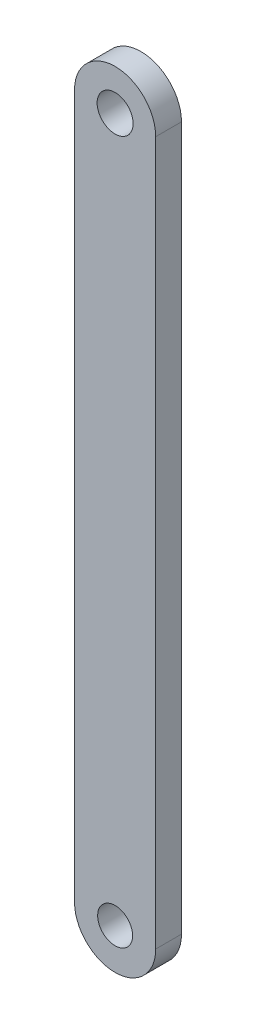
ISO-10303-21;
HEADER;
FILE_DESCRIPTION(('STEP AP214'),'2;1');
FILE_NAME('part.step','',(''),(''),'','','');
FILE_SCHEMA(('AUTOMOTIVE_DESIGN { 1 0 10303 214 1 1 1 1 }'));
ENDSEC;
DATA;
#1=APPLICATION_CONTEXT('core data for automotive mechanical design processes');
#2=APPLICATION_PROTOCOL_DEFINITION('international standard','automotive_design',2000,#1);
#3=PRODUCT_CONTEXT('',#1,'mechanical');
#4=PRODUCT('Part','Part','',(#3));
#5=PRODUCT_RELATED_PRODUCT_CATEGORY('part','',(#4));
#6=PRODUCT_DEFINITION_FORMATION('','',#4);
#7=PRODUCT_DEFINITION_CONTEXT('part definition',#1,'design');
#8=PRODUCT_DEFINITION('design','',#6,#7);
#9=PRODUCT_DEFINITION_SHAPE('','',#8);
#10=(LENGTH_UNIT() NAMED_UNIT(*) SI_UNIT(.MILLI.,.METRE.));
#11=(NAMED_UNIT(*) PLANE_ANGLE_UNIT() SI_UNIT($,.RADIAN.));
#12=(NAMED_UNIT(*) SI_UNIT($,.STERADIAN.) SOLID_ANGLE_UNIT());
#13=UNCERTAINTY_MEASURE_WITH_UNIT(LENGTH_MEASURE(1.E-05),#10,'distance_accuracy_value','');
#14=(GEOMETRIC_REPRESENTATION_CONTEXT(3) GLOBAL_UNCERTAINTY_ASSIGNED_CONTEXT((#13)) GLOBAL_UNIT_ASSIGNED_CONTEXT((#10,
#11,#12)) REPRESENTATION_CONTEXT('',''));
#15=CARTESIAN_POINT('',(0.,0.,0.));
#16=DIRECTION('',(0.,0.,1.));
#17=DIRECTION('',(1.,0.,0.));
#18=AXIS2_PLACEMENT_3D('',#15,#16,#17);
#19=CARTESIAN_POINT('',(0.,0.,4.7625));
#20=DIRECTION('',(0.,0.,1.));
#21=DIRECTION('',(1.,0.,0.));
#22=AXIS2_PLACEMENT_3D('',#19,#20,#21);
#23=PLANE('',#22);
#24=CARTESIAN_POINT('',(0.,0.,4.7625));
#25=DIRECTION('',(0.,0.,1.));
#26=DIRECTION('',(1.,0.,0.));
#27=AXIS2_PLACEMENT_3D('',#24,#25,#26);
#28=CIRCLE('',#27,3.225);
#29=CARTESIAN_POINT('',(-3.225,0.,4.7625));
#30=VERTEX_POINT('',#29);
#31=EDGE_CURVE('E100',#30,#30,#28,.T.);
#32=ORIENTED_EDGE('',*,*,#31,.F.);
#33=EDGE_LOOP('',(#32));
#34=FACE_BOUND('',#33,.T.);
#35=CARTESIAN_POINT('',(0.,0.,4.7625));
#36=DIRECTION('',(0.,0.,1.));
#37=DIRECTION('',(1.,0.,0.));
#38=AXIS2_PLACEMENT_3D('',#35,#36,#37);
#39=CIRCLE('',#38,7.5);
#40=CARTESIAN_POINT('',(-7.5,0.,4.7625));
#41=VERTEX_POINT('',#40);
#42=CARTESIAN_POINT('',(7.5,0.,4.7625));
#43=VERTEX_POINT('',#42);
#44=EDGE_CURVE('E85',#41,#43,#39,.T.);
#45=ORIENTED_EDGE('',*,*,#44,.T.);
#46=DIRECTION('',(0.,1.,0.));
#47=VECTOR('',#46,1.);
#48=CARTESIAN_POINT('',(7.5,0.,4.7625));
#49=LINE('',#48,#47);
#50=CARTESIAN_POINT('',(7.5,130.,4.7625));
#51=VERTEX_POINT('',#50);
#52=EDGE_CURVE('E80',#43,#51,#49,.T.);
#53=ORIENTED_EDGE('',*,*,#52,.T.);
#54=CARTESIAN_POINT('',(0.,130.,4.7625));
#55=DIRECTION('',(0.,0.,1.));
#56=DIRECTION('',(1.,0.,0.));
#57=AXIS2_PLACEMENT_3D('',#54,#55,#56);
#58=CIRCLE('',#57,7.5);
#59=CARTESIAN_POINT('',(-7.5,130.,4.7625));
#60=VERTEX_POINT('',#59);
#61=EDGE_CURVE('E83',#51,#60,#58,.T.);
#62=ORIENTED_EDGE('',*,*,#61,.T.);
#63=DIRECTION('',(0.,-1.,0.));
#64=VECTOR('',#63,1.);
#65=CARTESIAN_POINT('',(-7.5,0.,4.7625));
#66=LINE('',#65,#64);
#67=EDGE_CURVE('E50',#60,#41,#66,.T.);
#68=ORIENTED_EDGE('',*,*,#67,.T.);
#69=EDGE_LOOP('',(#45,#53,#62,#68));
#70=FACE_BOUND('',#69,.T.);
#71=CARTESIAN_POINT('',(0.,130.,4.7625));
#72=DIRECTION('',(0.,0.,1.));
#73=DIRECTION('',(1.,0.,0.));
#74=AXIS2_PLACEMENT_3D('',#71,#72,#73);
#75=CIRCLE('',#74,3.325);
#76=CARTESIAN_POINT('',(-3.325,130.,4.7625));
#77=VERTEX_POINT('',#76);
#78=EDGE_CURVE('E115',#77,#77,#75,.T.);
#79=ORIENTED_EDGE('',*,*,#78,.F.);
#80=EDGE_LOOP('',(#79));
#81=FACE_BOUND('',#80,.T.);
#82=ADVANCED_FACE('F33',(#34,#70,#81),#23,.T.);
#83=CARTESIAN_POINT('',(0.,0.,0.));
#84=DIRECTION('',(0.,0.,1.));
#85=DIRECTION('',(1.,0.,0.));
#86=AXIS2_PLACEMENT_3D('',#83,#84,#85);
#87=PLANE('',#86);
#88=CARTESIAN_POINT('',(0.,0.,0.));
#89=DIRECTION('',(0.,0.,1.));
#90=DIRECTION('',(1.,0.,0.));
#91=AXIS2_PLACEMENT_3D('',#88,#89,#90);
#92=CIRCLE('',#91,7.5);
#93=CARTESIAN_POINT('',(-7.5,0.,0.));
#94=VERTEX_POINT('',#93);
#95=CARTESIAN_POINT('',(7.5,0.,0.));
#96=VERTEX_POINT('',#95);
#97=EDGE_CURVE('E97',#94,#96,#92,.T.);
#98=ORIENTED_EDGE('',*,*,#97,.F.);
#99=DIRECTION('',(0.,-1.,0.));
#100=VECTOR('',#99,1.);
#101=CARTESIAN_POINT('',(-7.5,0.,0.));
#102=LINE('',#101,#100);
#103=CARTESIAN_POINT('',(-7.5,130.,0.));
#104=VERTEX_POINT('',#103);
#105=EDGE_CURVE('E73',#104,#94,#102,.T.);
#106=ORIENTED_EDGE('',*,*,#105,.F.);
#107=CARTESIAN_POINT('',(0.,130.,0.));
#108=DIRECTION('',(0.,0.,1.));
#109=DIRECTION('',(1.,0.,0.));
#110=AXIS2_PLACEMENT_3D('',#107,#108,#109);
#111=CIRCLE('',#110,7.5);
#112=CARTESIAN_POINT('',(7.5,130.,0.));
#113=VERTEX_POINT('',#112);
#114=EDGE_CURVE('E67',#113,#104,#111,.T.);
#115=ORIENTED_EDGE('',*,*,#114,.F.);
#116=DIRECTION('',(0.,1.,0.));
#117=VECTOR('',#116,1.);
#118=CARTESIAN_POINT('',(7.5,0.,0.));
#119=LINE('',#118,#117);
#120=EDGE_CURVE('E89',#96,#113,#119,.T.);
#121=ORIENTED_EDGE('',*,*,#120,.F.);
#122=EDGE_LOOP('',(#98,#106,#115,#121));
#123=FACE_BOUND('',#122,.T.);
#124=CARTESIAN_POINT('',(0.,0.,0.));
#125=DIRECTION('',(0.,0.,1.));
#126=DIRECTION('',(1.,0.,0.));
#127=AXIS2_PLACEMENT_3D('',#124,#125,#126);
#128=CIRCLE('',#127,3.225);
#129=CARTESIAN_POINT('',(-3.225,0.,0.));
#130=VERTEX_POINT('',#129);
#131=EDGE_CURVE('E112',#130,#130,#128,.T.);
#132=ORIENTED_EDGE('',*,*,#131,.T.);
#133=EDGE_LOOP('',(#132));
#134=FACE_BOUND('',#133,.T.);
#135=CARTESIAN_POINT('',(0.,130.,0.));
#136=DIRECTION('',(0.,0.,1.));
#137=DIRECTION('',(1.,0.,0.));
#138=AXIS2_PLACEMENT_3D('',#135,#136,#137);
#139=CIRCLE('',#138,3.325);
#140=CARTESIAN_POINT('',(-3.325,130.,0.));
#141=VERTEX_POINT('',#140);
#142=EDGE_CURVE('E118',#141,#141,#139,.T.);
#143=ORIENTED_EDGE('',*,*,#142,.T.);
#144=EDGE_LOOP('',(#143));
#145=FACE_BOUND('',#144,.T.);
#146=ADVANCED_FACE('F108',(#123,#134,#145),#87,.F.);
#147=CARTESIAN_POINT('',(0.,0.,4.7625));
#148=DIRECTION('',(0.,0.,-1.));
#149=DIRECTION('',(-1.,0.,0.));
#150=AXIS2_PLACEMENT_3D('',#147,#148,#149);
#151=CYLINDRICAL_SURFACE('',#150,7.5);
#152=ORIENTED_EDGE('',*,*,#97,.T.);
#153=DIRECTION('',(0.,0.,-1.));
#154=VECTOR('',#153,1.);
#155=CARTESIAN_POINT('',(7.5,0.,4.7625));
#156=LINE('',#155,#154);
#157=EDGE_CURVE('E11',#43,#96,#156,.T.);
#158=ORIENTED_EDGE('',*,*,#157,.F.);
#159=ORIENTED_EDGE('',*,*,#44,.F.);
#160=DIRECTION('',(0.,0.,-1.));
#161=VECTOR('',#160,1.);
#162=CARTESIAN_POINT('',(-7.5,0.,4.7625));
#163=LINE('',#162,#161);
#164=EDGE_CURVE('E93',#41,#94,#163,.T.);
#165=ORIENTED_EDGE('',*,*,#164,.T.);
#166=EDGE_LOOP('',(#152,#158,#159,#165));
#167=FACE_BOUND('',#166,.T.);
#168=ADVANCED_FACE('F35',(#167),#151,.T.);
#169=CARTESIAN_POINT('',(7.5,0.,4.7625));
#170=DIRECTION('',(-1.,0.,0.));
#171=DIRECTION('',(0.,0.,1.));
#172=AXIS2_PLACEMENT_3D('',#169,#170,#171);
#173=PLANE('',#172);
#174=ORIENTED_EDGE('',*,*,#120,.T.);
#175=DIRECTION('',(0.,0.,-1.));
#176=VECTOR('',#175,1.);
#177=CARTESIAN_POINT('',(7.5,130.,4.7625));
#178=LINE('',#177,#176);
#179=EDGE_CURVE('E42',#51,#113,#178,.T.);
#180=ORIENTED_EDGE('',*,*,#179,.F.);
#181=ORIENTED_EDGE('',*,*,#52,.F.);
#182=ORIENTED_EDGE('',*,*,#157,.T.);
#183=EDGE_LOOP('',(#174,#180,#181,#182));
#184=FACE_BOUND('',#183,.T.);
#185=ADVANCED_FACE('F88',(#184),#173,.F.);
#186=CARTESIAN_POINT('',(0.,130.,4.7625));
#187=DIRECTION('',(0.,0.,-1.));
#188=DIRECTION('',(-1.,0.,0.));
#189=AXIS2_PLACEMENT_3D('',#186,#187,#188);
#190=CYLINDRICAL_SURFACE('',#189,7.5);
#191=ORIENTED_EDGE('',*,*,#114,.T.);
#192=DIRECTION('',(0.,0.,-1.));
#193=VECTOR('',#192,1.);
#194=CARTESIAN_POINT('',(-7.5,130.,4.7625));
#195=LINE('',#194,#193);
#196=EDGE_CURVE('E90',#60,#104,#195,.T.);
#197=ORIENTED_EDGE('',*,*,#196,.F.);
#198=ORIENTED_EDGE('',*,*,#61,.F.);
#199=ORIENTED_EDGE('',*,*,#179,.T.);
#200=EDGE_LOOP('',(#191,#197,#198,#199));
#201=FACE_BOUND('',#200,.T.);
#202=ADVANCED_FACE('F91',(#201),#190,.T.);
#203=CARTESIAN_POINT('',(-7.5,0.,4.7625));
#204=DIRECTION('',(1.,0.,0.));
#205=DIRECTION('',(0.,0.,-1.));
#206=AXIS2_PLACEMENT_3D('',#203,#204,#205);
#207=PLANE('',#206);
#208=ORIENTED_EDGE('',*,*,#105,.T.);
#209=ORIENTED_EDGE('',*,*,#164,.F.);
#210=ORIENTED_EDGE('',*,*,#67,.F.);
#211=ORIENTED_EDGE('',*,*,#196,.T.);
#212=EDGE_LOOP('',(#208,#209,#210,#211));
#213=FACE_BOUND('',#212,.T.);
#214=ADVANCED_FACE('F105',(#213),#207,.F.);
#215=CARTESIAN_POINT('',(0.,0.,4.7625));
#216=DIRECTION('',(0.,0.,-1.));
#217=DIRECTION('',(-1.,0.,0.));
#218=AXIS2_PLACEMENT_3D('',#215,#216,#217);
#219=CYLINDRICAL_SURFACE('',#218,3.225);
#220=CARTESIAN_POINT('',(-3.225,0.,4.7625));
#221=CARTESIAN_POINT('',(-3.225,0.,4.712890625));
#222=CARTESIAN_POINT('',(-3.225,0.,4.66328125));
#223=CARTESIAN_POINT('',(-3.225,0.,4.5640625));
#224=CARTESIAN_POINT('',(-3.225,0.,4.514453125));
#225=CARTESIAN_POINT('',(-3.225,0.,4.415234375));
#226=CARTESIAN_POINT('',(-3.225,0.,4.365625));
#227=CARTESIAN_POINT('',(-3.225,0.,4.26640625));
#228=CARTESIAN_POINT('',(-3.225,0.,4.216796875));
#229=CARTESIAN_POINT('',(-3.225,0.,4.117578125));
#230=CARTESIAN_POINT('',(-3.225,0.,4.06796875));
#231=CARTESIAN_POINT('',(-3.225,0.,3.96875));
#232=CARTESIAN_POINT('',(-3.225,0.,3.919140625));
#233=CARTESIAN_POINT('',(-3.225,0.,3.819921875));
#234=CARTESIAN_POINT('',(-3.225,0.,3.7703125));
#235=CARTESIAN_POINT('',(-3.225,0.,3.67109375));
#236=CARTESIAN_POINT('',(-3.225,0.,3.621484375));
#237=CARTESIAN_POINT('',(-3.225,0.,3.522265625));
#238=CARTESIAN_POINT('',(-3.225,0.,3.47265625));
#239=CARTESIAN_POINT('',(-3.225,0.,3.3734375));
#240=CARTESIAN_POINT('',(-3.225,0.,3.323828125));
#241=CARTESIAN_POINT('',(-3.225,0.,3.224609375));
#242=CARTESIAN_POINT('',(-3.225,0.,3.175));
#243=CARTESIAN_POINT('',(-3.225,0.,3.07578125));
#244=CARTESIAN_POINT('',(-3.225,0.,3.026171875));
#245=CARTESIAN_POINT('',(-3.225,0.,2.926953125));
#246=CARTESIAN_POINT('',(-3.225,0.,2.87734375));
#247=CARTESIAN_POINT('',(-3.225,0.,2.778125));
#248=CARTESIAN_POINT('',(-3.225,0.,2.728515625));
#249=CARTESIAN_POINT('',(-3.225,0.,2.629296875));
#250=CARTESIAN_POINT('',(-3.225,0.,2.5796875));
#251=CARTESIAN_POINT('',(-3.225,0.,2.48046875));
#252=CARTESIAN_POINT('',(-3.225,0.,2.430859375));
#253=CARTESIAN_POINT('',(-3.225,0.,2.331640625));
#254=CARTESIAN_POINT('',(-3.225,0.,2.28203125));
#255=CARTESIAN_POINT('',(-3.225,0.,2.1828125));
#256=CARTESIAN_POINT('',(-3.225,0.,2.133203125));
#257=CARTESIAN_POINT('',(-3.225,0.,2.033984375));
#258=CARTESIAN_POINT('',(-3.225,0.,1.984375));
#259=CARTESIAN_POINT('',(-3.225,0.,1.88515625));
#260=CARTESIAN_POINT('',(-3.225,0.,1.835546875));
#261=CARTESIAN_POINT('',(-3.225,0.,1.736328125));
#262=CARTESIAN_POINT('',(-3.225,0.,1.68671875));
#263=CARTESIAN_POINT('',(-3.225,0.,1.5875));
#264=CARTESIAN_POINT('',(-3.225,0.,1.537890625));
#265=CARTESIAN_POINT('',(-3.225,0.,1.438671875));
#266=CARTESIAN_POINT('',(-3.225,0.,1.3890625));
#267=CARTESIAN_POINT('',(-3.225,0.,1.28984375));
#268=CARTESIAN_POINT('',(-3.225,0.,1.240234375));
#269=CARTESIAN_POINT('',(-3.225,0.,1.141015625));
#270=CARTESIAN_POINT('',(-3.225,0.,1.09140625));
#271=CARTESIAN_POINT('',(-3.225,0.,0.9921875));
#272=CARTESIAN_POINT('',(-3.225,0.,0.942578125));
#273=CARTESIAN_POINT('',(-3.225,0.,0.843359375));
#274=CARTESIAN_POINT('',(-3.225,0.,0.79375));
#275=CARTESIAN_POINT('',(-3.225,0.,0.69453125));
#276=CARTESIAN_POINT('',(-3.225,0.,0.644921875));
#277=CARTESIAN_POINT('',(-3.225,0.,0.545703125));
#278=CARTESIAN_POINT('',(-3.225,0.,0.49609375));
#279=CARTESIAN_POINT('',(-3.225,0.,0.396875));
#280=CARTESIAN_POINT('',(-3.225,0.,0.347265625));
#281=CARTESIAN_POINT('',(-3.225,0.,0.248046875));
#282=CARTESIAN_POINT('',(-3.225,0.,0.1984375));
#283=CARTESIAN_POINT('',(-3.225,0.,0.09921875));
#284=CARTESIAN_POINT('',(-3.225,0.,0.049609375));
#285=CARTESIAN_POINT('',(-3.225,0.,0.));
#286=B_SPLINE_CURVE_WITH_KNOTS('',3,(#220,#221,#222,#223,#224,#225,#226,#227,#228,#229,#230,
#231,#232,#233,#234,#235,#236,#237,#238,#239,#240,#241,#242,#243,#244,#245,#246,#247,#248,#249,
#250,#251,#252,#253,#254,#255,#256,#257,#258,#259,#260,#261,#262,#263,#264,#265,#266,#267,#268,
#269,#270,#271,#272,#273,#274,#275,#276,#277,#278,#279,#280,#281,#282,#283,#284,#285),
.UNSPECIFIED.,.F.,.F.,(4,2,2,2,2,2,2,2,2,2,2,2,2,2,2,2,2,2,2,2,2,2,2,2,2,2,2,2,2,2,2,2,4),(0.,
0.148828124999999,0.297656249999999,0.446484374999999,0.595312499999999,0.744140625,0.89296875,
1.041796875,1.190625,1.339453125,1.48828125,1.637109375,1.7859375,1.934765625,2.08359375,
2.232421875,2.38125,2.530078125,2.67890625,2.827734375,2.9765625,3.125390625,3.27421875,
3.423046875,3.571875,3.720703125,3.86953125,4.018359375,4.1671875,4.316015625,4.46484375,
4.613671875,4.7625),.UNSPECIFIED.);
#287=EDGE_CURVE('BSEAM135',#30,#130,#286,.T.);
#288=ORIENTED_EDGE('',*,*,#31,.T.);
#289=ORIENTED_EDGE('',*,*,#131,.F.);
#290=ORIENTED_EDGE('',*,*,#287,.T.);
#291=ORIENTED_EDGE('',*,*,#287,.F.);
#292=EDGE_LOOP('',(#288,#290,#289,#291));
#293=FACE_BOUND('',#292,.T.);
#294=ADVANCED_FACE('F135',(#293),#219,.F.);
#295=CARTESIAN_POINT('',(0.,130.,4.7625));
#296=DIRECTION('',(0.,0.,-1.));
#297=DIRECTION('',(-1.,0.,0.));
#298=AXIS2_PLACEMENT_3D('',#295,#296,#297);
#299=CYLINDRICAL_SURFACE('',#298,3.325);
#300=CARTESIAN_POINT('',(-3.325,130.,4.7625));
#301=CARTESIAN_POINT('',(-3.325,130.,4.712890625));
#302=CARTESIAN_POINT('',(-3.325,130.,4.66328125));
#303=CARTESIAN_POINT('',(-3.325,130.,4.5640625));
#304=CARTESIAN_POINT('',(-3.325,130.,4.514453125));
#305=CARTESIAN_POINT('',(-3.325,130.,4.415234375));
#306=CARTESIAN_POINT('',(-3.325,130.,4.365625));
#307=CARTESIAN_POINT('',(-3.325,130.,4.26640625));
#308=CARTESIAN_POINT('',(-3.325,130.,4.216796875));
#309=CARTESIAN_POINT('',(-3.325,130.,4.117578125));
#310=CARTESIAN_POINT('',(-3.325,130.,4.06796875));
#311=CARTESIAN_POINT('',(-3.325,130.,3.96875));
#312=CARTESIAN_POINT('',(-3.325,130.,3.919140625));
#313=CARTESIAN_POINT('',(-3.325,130.,3.819921875));
#314=CARTESIAN_POINT('',(-3.325,130.,3.7703125));
#315=CARTESIAN_POINT('',(-3.325,130.,3.67109375));
#316=CARTESIAN_POINT('',(-3.325,130.,3.621484375));
#317=CARTESIAN_POINT('',(-3.325,130.,3.522265625));
#318=CARTESIAN_POINT('',(-3.325,130.,3.47265625));
#319=CARTESIAN_POINT('',(-3.325,130.,3.3734375));
#320=CARTESIAN_POINT('',(-3.325,130.,3.323828125));
#321=CARTESIAN_POINT('',(-3.325,130.,3.224609375));
#322=CARTESIAN_POINT('',(-3.325,130.,3.175));
#323=CARTESIAN_POINT('',(-3.325,130.,3.07578125));
#324=CARTESIAN_POINT('',(-3.325,130.,3.026171875));
#325=CARTESIAN_POINT('',(-3.325,130.,2.926953125));
#326=CARTESIAN_POINT('',(-3.325,130.,2.87734375));
#327=CARTESIAN_POINT('',(-3.325,130.,2.778125));
#328=CARTESIAN_POINT('',(-3.325,130.,2.728515625));
#329=CARTESIAN_POINT('',(-3.325,130.,2.629296875));
#330=CARTESIAN_POINT('',(-3.325,130.,2.5796875));
#331=CARTESIAN_POINT('',(-3.325,130.,2.48046875));
#332=CARTESIAN_POINT('',(-3.325,130.,2.430859375));
#333=CARTESIAN_POINT('',(-3.325,130.,2.331640625));
#334=CARTESIAN_POINT('',(-3.325,130.,2.28203125));
#335=CARTESIAN_POINT('',(-3.325,130.,2.1828125));
#336=CARTESIAN_POINT('',(-3.325,130.,2.133203125));
#337=CARTESIAN_POINT('',(-3.325,130.,2.033984375));
#338=CARTESIAN_POINT('',(-3.325,130.,1.984375));
#339=CARTESIAN_POINT('',(-3.325,130.,1.88515625));
#340=CARTESIAN_POINT('',(-3.325,130.,1.835546875));
#341=CARTESIAN_POINT('',(-3.325,130.,1.736328125));
#342=CARTESIAN_POINT('',(-3.325,130.,1.68671875));
#343=CARTESIAN_POINT('',(-3.325,130.,1.5875));
#344=CARTESIAN_POINT('',(-3.325,130.,1.537890625));
#345=CARTESIAN_POINT('',(-3.325,130.,1.438671875));
#346=CARTESIAN_POINT('',(-3.325,130.,1.3890625));
#347=CARTESIAN_POINT('',(-3.325,130.,1.28984375));
#348=CARTESIAN_POINT('',(-3.325,130.,1.240234375));
#349=CARTESIAN_POINT('',(-3.325,130.,1.141015625));
#350=CARTESIAN_POINT('',(-3.325,130.,1.09140625));
#351=CARTESIAN_POINT('',(-3.325,130.,0.9921875));
#352=CARTESIAN_POINT('',(-3.325,130.,0.942578125));
#353=CARTESIAN_POINT('',(-3.325,130.,0.843359375));
#354=CARTESIAN_POINT('',(-3.325,130.,0.79375));
#355=CARTESIAN_POINT('',(-3.325,130.,0.69453125));
#356=CARTESIAN_POINT('',(-3.325,130.,0.644921875));
#357=CARTESIAN_POINT('',(-3.325,130.,0.545703125));
#358=CARTESIAN_POINT('',(-3.325,130.,0.49609375));
#359=CARTESIAN_POINT('',(-3.325,130.,0.396875));
#360=CARTESIAN_POINT('',(-3.325,130.,0.347265625));
#361=CARTESIAN_POINT('',(-3.325,130.,0.248046875));
#362=CARTESIAN_POINT('',(-3.325,130.,0.1984375));
#363=CARTESIAN_POINT('',(-3.325,130.,0.09921875));
#364=CARTESIAN_POINT('',(-3.325,130.,0.049609375));
#365=CARTESIAN_POINT('',(-3.325,130.,0.));
#366=B_SPLINE_CURVE_WITH_KNOTS('',3,(#300,#301,#302,#303,#304,#305,#306,#307,#308,#309,#310,
#311,#312,#313,#314,#315,#316,#317,#318,#319,#320,#321,#322,#323,#324,#325,#326,#327,#328,#329,
#330,#331,#332,#333,#334,#335,#336,#337,#338,#339,#340,#341,#342,#343,#344,#345,#346,#347,#348,
#349,#350,#351,#352,#353,#354,#355,#356,#357,#358,#359,#360,#361,#362,#363,#364,#365),
.UNSPECIFIED.,.F.,.F.,(4,2,2,2,2,2,2,2,2,2,2,2,2,2,2,2,2,2,2,2,2,2,2,2,2,2,2,2,2,2,2,2,4),(0.,
0.148828124999999,0.297656249999999,0.446484374999999,0.595312499999999,0.744140625,0.89296875,
1.041796875,1.190625,1.339453125,1.48828125,1.637109375,1.7859375,1.934765625,2.08359375,
2.232421875,2.38125,2.530078125,2.67890625,2.827734375,2.9765625,3.125390625,3.27421875,
3.423046875,3.571875,3.720703125,3.86953125,4.018359375,4.1671875,4.316015625,4.46484375,
4.613671875,4.7625),.UNSPECIFIED.);
#367=EDGE_CURVE('BSEAM124',#77,#141,#366,.T.);
#368=ORIENTED_EDGE('',*,*,#78,.T.);
#369=ORIENTED_EDGE('',*,*,#142,.F.);
#370=ORIENTED_EDGE('',*,*,#367,.T.);
#371=ORIENTED_EDGE('',*,*,#367,.F.);
#372=EDGE_LOOP('',(#368,#370,#369,#371));
#373=FACE_BOUND('',#372,.T.);
#374=ADVANCED_FACE('F124',(#373),#299,.F.);
#375=CLOSED_SHELL('',(#82,#146,#168,#185,#202,#214,#294,#374));
#376=MANIFOLD_SOLID_BREP('B2',#375);
#377=ADVANCED_BREP_SHAPE_REPRESENTATION('',(#18,#376),#14);
#378=SHAPE_DEFINITION_REPRESENTATION(#9,#377);
ENDSEC;
END-ISO-10303-21;
